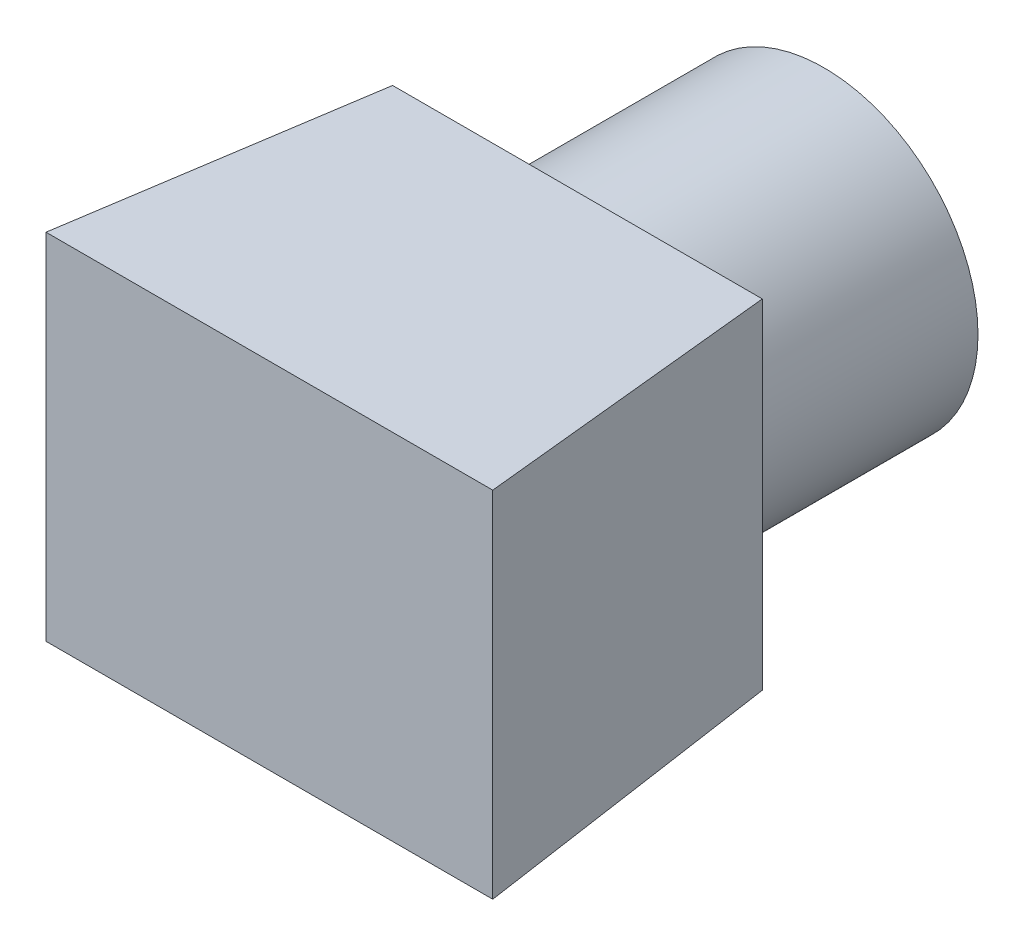
ISO-10303-21;
HEADER;
FILE_DESCRIPTION(('STEP AP214'),'2;1');
FILE_NAME('part.step','',(''),(''),'','','');
FILE_SCHEMA(('AUTOMOTIVE_DESIGN { 1 0 10303 214 1 1 1 1 }'));
ENDSEC;
DATA;
#1=APPLICATION_CONTEXT('core data for automotive mechanical design processes');
#2=APPLICATION_PROTOCOL_DEFINITION('international standard','automotive_design',2000,#1);
#3=PRODUCT_CONTEXT('',#1,'mechanical');
#4=PRODUCT('Part','Part','',(#3));
#5=PRODUCT_RELATED_PRODUCT_CATEGORY('part','',(#4));
#6=PRODUCT_DEFINITION_FORMATION('','',#4);
#7=PRODUCT_DEFINITION_CONTEXT('part definition',#1,'design');
#8=PRODUCT_DEFINITION('design','',#6,#7);
#9=PRODUCT_DEFINITION_SHAPE('','',#8);
#10=(LENGTH_UNIT() NAMED_UNIT(*) SI_UNIT(.MILLI.,.METRE.));
#11=(NAMED_UNIT(*) PLANE_ANGLE_UNIT() SI_UNIT($,.RADIAN.));
#12=(NAMED_UNIT(*) SI_UNIT($,.STERADIAN.) SOLID_ANGLE_UNIT());
#13=UNCERTAINTY_MEASURE_WITH_UNIT(LENGTH_MEASURE(1.E-05),#10,'distance_accuracy_value','');
#14=(GEOMETRIC_REPRESENTATION_CONTEXT(3) GLOBAL_UNCERTAINTY_ASSIGNED_CONTEXT((#13)) GLOBAL_UNIT_ASSIGNED_CONTEXT((#10,
#11,#12)) REPRESENTATION_CONTEXT('',''));
#15=CARTESIAN_POINT('',(0.,0.,0.));
#16=DIRECTION('',(0.,0.,1.));
#17=DIRECTION('',(1.,0.,0.));
#18=AXIS2_PLACEMENT_3D('',#15,#16,#17);
#19=CARTESIAN_POINT('',(0.,0.,8.));
#20=DIRECTION('',(0.,0.,-1.));
#21=DIRECTION('',(-1.,0.,0.));
#22=AXIS2_PLACEMENT_3D('',#19,#20,#21);
#23=CYLINDRICAL_SURFACE('',#22,5.);
#24=CARTESIAN_POINT('',(0.,0.,8.));
#25=DIRECTION('',(0.,0.,1.));
#26=DIRECTION('',(1.,0.,0.));
#27=AXIS2_PLACEMENT_3D('',#24,#25,#26);
#28=CIRCLE('',#27,5.);
#29=CARTESIAN_POINT('',(5.,0.,8.));
#30=VERTEX_POINT('',#29);
#31=EDGE_CURVE('E12',#30,#30,#28,.T.);
#32=ORIENTED_EDGE('',*,*,#31,.F.);
#33=EDGE_LOOP('',(#32));
#34=FACE_BOUND('',#33,.T.);
#35=CARTESIAN_POINT('',(0.,0.,0.));
#36=DIRECTION('',(0.,0.,1.));
#37=DIRECTION('',(1.,0.,0.));
#38=AXIS2_PLACEMENT_3D('',#35,#36,#37);
#39=CIRCLE('',#38,5.);
#40=CARTESIAN_POINT('',(5.,0.,0.));
#41=VERTEX_POINT('',#40);
#42=EDGE_CURVE('E54',#41,#41,#39,.T.);
#43=ORIENTED_EDGE('',*,*,#42,.T.);
#44=EDGE_LOOP('',(#43));
#45=FACE_BOUND('',#44,.T.);
#46=ADVANCED_FACE('F43',(#34,#45),#23,.T.);
#47=CARTESIAN_POINT('',(0.,0.,0.));
#48=DIRECTION('',(0.,0.,1.));
#49=DIRECTION('',(1.,0.,0.));
#50=AXIS2_PLACEMENT_3D('',#47,#48,#49);
#51=PLANE('',#50);
#52=ORIENTED_EDGE('',*,*,#42,.F.);
#53=EDGE_LOOP('',(#52));
#54=FACE_BOUND('',#53,.T.);
#55=ADVANCED_FACE('F223',(#54),#51,.F.);
#56=CARTESIAN_POINT('',(0.,0.,8.));
#57=DIRECTION('',(0.,0.,1.));
#58=DIRECTION('',(1.,0.,0.));
#59=AXIS2_PLACEMENT_3D('',#56,#57,#58);
#60=PLANE('',#59);
#61=ORIENTED_EDGE('',*,*,#31,.T.);
#62=EDGE_LOOP('',(#61));
#63=FACE_BOUND('',#62,.T.);
#64=DIRECTION('',(0.,1.,0.));
#65=VECTOR('',#64,1.);
#66=CARTESIAN_POINT('',(-6.,0.,8.));
#67=LINE('',#66,#65);
#68=CARTESIAN_POINT('',(-6.,5.5,8.));
#69=VERTEX_POINT('',#68);
#70=CARTESIAN_POINT('',(-6.,-5.5,8.));
#71=VERTEX_POINT('',#70);
#72=EDGE_CURVE('E62',#69,#71,#67,.F.);
#73=ORIENTED_EDGE('',*,*,#72,.F.);
#74=DIRECTION('',(1.,0.,0.));
#75=VECTOR('',#74,1.);
#76=CARTESIAN_POINT('',(0.,5.5,8.));
#77=LINE('',#76,#75);
#78=CARTESIAN_POINT('',(6.,5.5,8.));
#79=VERTEX_POINT('',#78);
#80=EDGE_CURVE('E191',#79,#69,#77,.F.);
#81=ORIENTED_EDGE('',*,*,#80,.F.);
#82=DIRECTION('',(0.,1.,0.));
#83=VECTOR('',#82,1.);
#84=CARTESIAN_POINT('',(6.,0.,8.));
#85=LINE('',#84,#83);
#86=CARTESIAN_POINT('',(6.,-5.5,8.));
#87=VERTEX_POINT('',#86);
#88=EDGE_CURVE('E114',#87,#79,#85,.T.);
#89=ORIENTED_EDGE('',*,*,#88,.F.);
#90=DIRECTION('',(1.,0.,0.));
#91=VECTOR('',#90,1.);
#92=CARTESIAN_POINT('',(0.,-5.5,8.));
#93=LINE('',#92,#91);
#94=EDGE_CURVE('E190',#71,#87,#93,.T.);
#95=ORIENTED_EDGE('',*,*,#94,.F.);
#96=EDGE_LOOP('',(#73,#81,#89,#95));
#97=FACE_BOUND('',#96,.T.);
#98=ADVANCED_FACE('F161',(#63,#97),#60,.F.);
#99=CARTESIAN_POINT('',(-4.92307692307692,0.,-0.615384615384615));
#100=DIRECTION('',(0.992277876713668,0.,0.124034734589208));
#101=DIRECTION('',(0.124034734589208,0.,-0.992277876713668));
#102=AXIS2_PLACEMENT_3D('',#99,#100,#101);
#103=PLANE('',#102);
#104=DIRECTION('',(-0.123996587660861,-0.0247993175321721,0.991972701286886));
#105=VECTOR('',#104,1.);
#106=CARTESIAN_POINT('',(-6.,-5.5,8.));
#107=LINE('',#106,#105);
#108=CARTESIAN_POINT('',(-7.25,-5.75,18.));
#109=VERTEX_POINT('',#108);
#110=EDGE_CURVE('E125',#71,#109,#107,.T.);
#111=ORIENTED_EDGE('',*,*,#110,.T.);
#112=DIRECTION('',(0.,-1.,0.));
#113=VECTOR('',#112,1.);
#114=CARTESIAN_POINT('',(-7.25,-5.75,18.));
#115=LINE('',#114,#113);
#116=CARTESIAN_POINT('',(-7.25,5.75,18.));
#117=VERTEX_POINT('',#116);
#118=EDGE_CURVE('E109',#117,#109,#115,.T.);
#119=ORIENTED_EDGE('',*,*,#118,.F.);
#120=DIRECTION('',(-0.123996587660861,0.0247993175321722,0.991972701286886));
#121=VECTOR('',#120,1.);
#122=CARTESIAN_POINT('',(-6.,5.5,8.));
#123=LINE('',#122,#121);
#124=EDGE_CURVE('E108',#69,#117,#123,.T.);
#125=ORIENTED_EDGE('',*,*,#124,.F.);
#126=ORIENTED_EDGE('',*,*,#72,.T.);
#127=EDGE_LOOP('',(#111,#119,#125,#126));
#128=FACE_BOUND('',#127,.T.);
#129=ADVANCED_FACE('F210',(#128),#103,.F.);
#130=CARTESIAN_POINT('',(0.,5.29668956901936,-0.132417239225485));
#131=DIRECTION('',(0.,-0.999687646408123,0.0249921911602032));
#132=DIRECTION('',(0.,-0.0249921911602032,-0.999687646408123));
#133=AXIS2_PLACEMENT_3D('',#130,#131,#132);
#134=PLANE('',#133);
#135=ORIENTED_EDGE('',*,*,#124,.T.);
#136=DIRECTION('',(-1.,0.,0.));
#137=VECTOR('',#136,1.);
#138=CARTESIAN_POINT('',(7.25,5.75,18.));
#139=LINE('',#138,#137);
#140=CARTESIAN_POINT('',(7.25,5.75,18.));
#141=VERTEX_POINT('',#140);
#142=EDGE_CURVE('E87',#141,#117,#139,.T.);
#143=ORIENTED_EDGE('',*,*,#142,.F.);
#144=DIRECTION('',(0.123996587660861,0.0247993175321722,0.991972701286886));
#145=VECTOR('',#144,1.);
#146=CARTESIAN_POINT('',(6.,5.5,8.));
#147=LINE('',#146,#145);
#148=EDGE_CURVE('E105',#79,#141,#147,.T.);
#149=ORIENTED_EDGE('',*,*,#148,.F.);
#150=ORIENTED_EDGE('',*,*,#80,.T.);
#151=EDGE_LOOP('',(#135,#143,#149,#150));
#152=FACE_BOUND('',#151,.T.);
#153=ADVANCED_FACE('F104',(#152),#134,.F.);
#154=CARTESIAN_POINT('',(0.,-5.29668956901936,-0.132417239225484));
#155=DIRECTION('',(0.,0.999687646408123,0.024992191160203));
#156=DIRECTION('',(0.,-0.024992191160203,0.999687646408123));
#157=AXIS2_PLACEMENT_3D('',#154,#155,#156);
#158=PLANE('',#157);
#159=DIRECTION('',(0.123996587660861,-0.0247993175321721,0.991972701286886));
#160=VECTOR('',#159,1.);
#161=CARTESIAN_POINT('',(6.,-5.5,8.));
#162=LINE('',#161,#160);
#163=CARTESIAN_POINT('',(7.25,-5.75,18.));
#164=VERTEX_POINT('',#163);
#165=EDGE_CURVE('E115',#87,#164,#162,.T.);
#166=ORIENTED_EDGE('',*,*,#165,.T.);
#167=DIRECTION('',(1.,0.,0.));
#168=VECTOR('',#167,1.);
#169=CARTESIAN_POINT('',(7.25,-5.75,18.));
#170=LINE('',#169,#168);
#171=EDGE_CURVE('E90',#109,#164,#170,.T.);
#172=ORIENTED_EDGE('',*,*,#171,.F.);
#173=ORIENTED_EDGE('',*,*,#110,.F.);
#174=ORIENTED_EDGE('',*,*,#94,.T.);
#175=EDGE_LOOP('',(#166,#172,#173,#174));
#176=FACE_BOUND('',#175,.T.);
#177=ADVANCED_FACE('F137',(#176),#158,.F.);
#178=CARTESIAN_POINT('',(4.92307692307692,0.,-0.615384615384615));
#179=DIRECTION('',(-0.992277876713668,0.,0.124034734589208));
#180=DIRECTION('',(0.124034734589208,0.,0.992277876713668));
#181=AXIS2_PLACEMENT_3D('',#178,#179,#180);
#182=PLANE('',#181);
#183=ORIENTED_EDGE('',*,*,#148,.T.);
#184=DIRECTION('',(0.,1.,0.));
#185=VECTOR('',#184,1.);
#186=CARTESIAN_POINT('',(7.25,-5.75,18.));
#187=LINE('',#186,#185);
#188=EDGE_CURVE('E82',#164,#141,#187,.T.);
#189=ORIENTED_EDGE('',*,*,#188,.F.);
#190=ORIENTED_EDGE('',*,*,#165,.F.);
#191=ORIENTED_EDGE('',*,*,#88,.T.);
#192=EDGE_LOOP('',(#183,#189,#190,#191));
#193=FACE_BOUND('',#192,.T.);
#194=ADVANCED_FACE('F113',(#193),#182,.F.);
#195=CARTESIAN_POINT('',(0.,0.,18.));
#196=DIRECTION('',(0.,0.,1.));
#197=DIRECTION('',(1.,0.,0.));
#198=AXIS2_PLACEMENT_3D('',#195,#196,#197);
#199=PLANE('',#198);
#200=ORIENTED_EDGE('',*,*,#118,.T.);
#201=ORIENTED_EDGE('',*,*,#171,.T.);
#202=ORIENTED_EDGE('',*,*,#188,.T.);
#203=ORIENTED_EDGE('',*,*,#142,.T.);
#204=EDGE_LOOP('',(#200,#201,#202,#203));
#205=FACE_BOUND('',#204,.T.);
#206=ADVANCED_FACE('F86',(#205),#199,.T.);
#207=CLOSED_SHELL('',(#46,#55,#98,#129,#153,#177,#194,#206));
#208=MANIFOLD_SOLID_BREP('B2',#207);
#209=ADVANCED_BREP_SHAPE_REPRESENTATION('',(#18,#208),#14);
#210=SHAPE_DEFINITION_REPRESENTATION(#9,#209);
ENDSEC;
END-ISO-10303-21;
